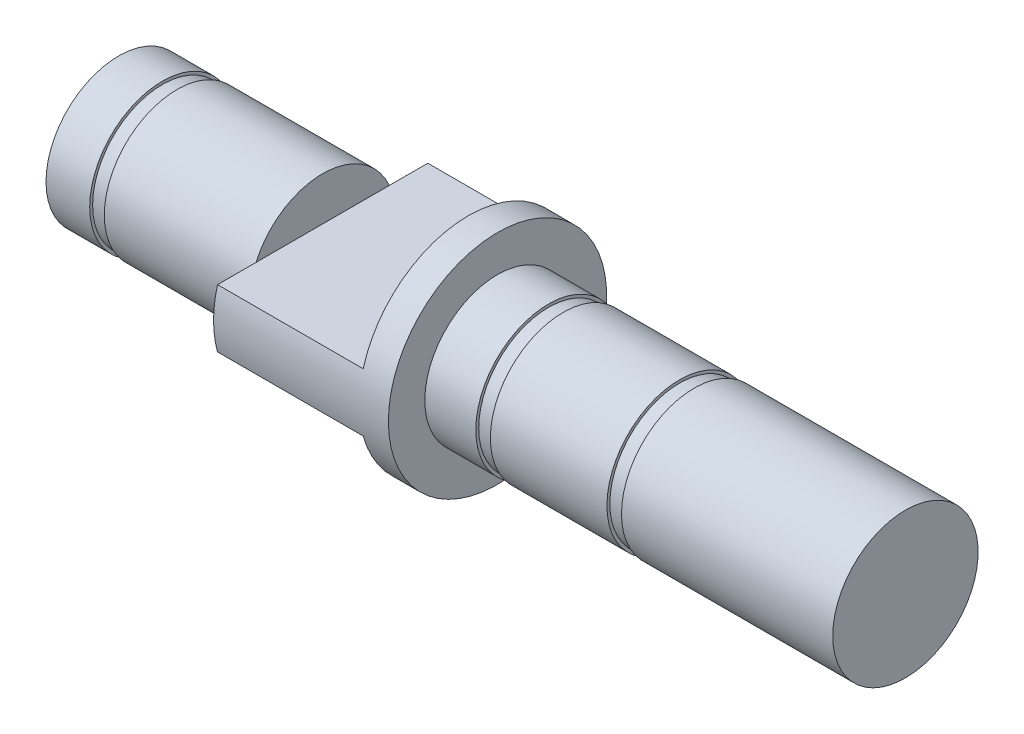
ISO-10303-21;
HEADER;
FILE_DESCRIPTION(('STEP AP214'),'2;1');
FILE_NAME('part.step','',(''),(''),'','','');
FILE_SCHEMA(('AUTOMOTIVE_DESIGN { 1 0 10303 214 1 1 1 1 }'));
ENDSEC;
DATA;
#1=APPLICATION_CONTEXT('core data for automotive mechanical design processes');
#2=APPLICATION_PROTOCOL_DEFINITION('international standard','automotive_design',2000,#1);
#3=PRODUCT_CONTEXT('',#1,'mechanical');
#4=PRODUCT('Part','Part','',(#3));
#5=PRODUCT_RELATED_PRODUCT_CATEGORY('part','',(#4));
#6=PRODUCT_DEFINITION_FORMATION('','',#4);
#7=PRODUCT_DEFINITION_CONTEXT('part definition',#1,'design');
#8=PRODUCT_DEFINITION('design','',#6,#7);
#9=PRODUCT_DEFINITION_SHAPE('','',#8);
#10=(LENGTH_UNIT() NAMED_UNIT(*) SI_UNIT(.MILLI.,.METRE.));
#11=(NAMED_UNIT(*) PLANE_ANGLE_UNIT() SI_UNIT($,.RADIAN.));
#12=(NAMED_UNIT(*) SI_UNIT($,.STERADIAN.) SOLID_ANGLE_UNIT());
#13=UNCERTAINTY_MEASURE_WITH_UNIT(LENGTH_MEASURE(1.E-05),#10,'distance_accuracy_value','');
#14=(GEOMETRIC_REPRESENTATION_CONTEXT(3) GLOBAL_UNCERTAINTY_ASSIGNED_CONTEXT((#13)) GLOBAL_UNIT_ASSIGNED_CONTEXT((#10,
#11,#12)) REPRESENTATION_CONTEXT('',''));
#15=CARTESIAN_POINT('',(0.,0.,0.));
#16=DIRECTION('',(0.,0.,1.));
#17=DIRECTION('',(1.,0.,0.));
#18=AXIS2_PLACEMENT_3D('',#15,#16,#17);
#19=CARTESIAN_POINT('',(14.,0.,-7.49));
#20=DIRECTION('',(1.,0.,0.));
#21=DIRECTION('',(0.,0.,-1.));
#22=AXIS2_PLACEMENT_3D('',#19,#20,#21);
#23=PLANE('',#22);
#24=CARTESIAN_POINT('',(14.,0.,0.));
#25=DIRECTION('',(-1.,0.,0.));
#26=DIRECTION('',(0.,0.,1.));
#27=AXIS2_PLACEMENT_3D('',#24,#25,#26);
#28=CIRCLE('',#27,7.49);
#29=CARTESIAN_POINT('',(14.,-2.,7.2180399001391));
#30=VERTEX_POINT('',#29);
#31=CARTESIAN_POINT('',(14.,2.,7.2180399001391));
#32=VERTEX_POINT('',#31);
#33=EDGE_CURVE('E111',#30,#32,#28,.T.);
#34=ORIENTED_EDGE('',*,*,#33,.T.);
#35=DIRECTION('',(0.,0.,1.));
#36=VECTOR('',#35,1.);
#37=CARTESIAN_POINT('',(14.,2.,7.22841614740048));
#38=LINE('',#37,#36);
#39=CARTESIAN_POINT('',(14.,2.,4.57166271721788));
#40=VERTEX_POINT('',#39);
#41=EDGE_CURVE('E115',#40,#32,#38,.T.);
#42=ORIENTED_EDGE('',*,*,#41,.F.);
#43=CARTESIAN_POINT('',(14.,0.,0.));
#44=DIRECTION('',(-1.,0.,0.));
#45=DIRECTION('',(0.,0.,1.));
#46=AXIS2_PLACEMENT_3D('',#43,#44,#45);
#47=CIRCLE('',#46,4.99);
#48=CARTESIAN_POINT('',(14.,-2.,4.57166271721789));
#49=VERTEX_POINT('',#48);
#50=EDGE_CURVE('E113',#49,#40,#47,.T.);
#51=ORIENTED_EDGE('',*,*,#50,.F.);
#52=DIRECTION('',(0.,0.,-1.));
#53=VECTOR('',#52,1.);
#54=CARTESIAN_POINT('',(14.,-2.,7.22841614740048));
#55=LINE('',#54,#53);
#56=EDGE_CURVE('E58',#30,#49,#55,.T.);
#57=ORIENTED_EDGE('',*,*,#56,.F.);
#58=EDGE_LOOP('',(#34,#42,#51,#57));
#59=FACE_BOUND('',#58,.T.);
#60=ADVANCED_FACE('F43',(#59),#23,.F.);
#61=CARTESIAN_POINT('',(0.,0.,-4.99));
#62=DIRECTION('',(1.,0.,0.));
#63=DIRECTION('',(0.,0.,-1.));
#64=AXIS2_PLACEMENT_3D('',#61,#62,#63);
#65=PLANE('',#64);
#66=CARTESIAN_POINT('',(0.,0.,0.));
#67=DIRECTION('',(-1.,0.,0.));
#68=DIRECTION('',(0.,0.,1.));
#69=AXIS2_PLACEMENT_3D('',#66,#67,#68);
#70=CIRCLE('',#69,4.99);
#71=CARTESIAN_POINT('',(0.,0.,4.99));
#72=VERTEX_POINT('',#71);
#73=EDGE_CURVE('E199',#72,#72,#70,.T.);
#74=ORIENTED_EDGE('',*,*,#73,.T.);
#75=EDGE_LOOP('',(#74));
#76=FACE_BOUND('',#75,.T.);
#77=ADVANCED_FACE('F45',(#76),#65,.F.);
#78=CARTESIAN_POINT('',(54.,0.,0.));
#79=DIRECTION('',(-1.,0.,0.));
#80=DIRECTION('',(0.,0.,1.));
#81=AXIS2_PLACEMENT_3D('',#78,#79,#80);
#82=PLANE('',#81);
#83=CARTESIAN_POINT('',(54.,0.,0.));
#84=DIRECTION('',(-1.,0.,0.));
#85=DIRECTION('',(0.,0.,1.));
#86=AXIS2_PLACEMENT_3D('',#83,#84,#85);
#87=CIRCLE('',#86,4.99000000000001);
#88=CARTESIAN_POINT('',(54.,0.,4.99000000000001));
#89=VERTEX_POINT('',#88);
#90=EDGE_CURVE('E162',#89,#89,#87,.T.);
#91=ORIENTED_EDGE('',*,*,#90,.F.);
#92=EDGE_LOOP('',(#91));
#93=FACE_BOUND('',#92,.T.);
#94=ADVANCED_FACE('F224',(#93),#82,.F.);
#95=CARTESIAN_POINT('',(0.,0.,0.));
#96=DIRECTION('',(-1.,0.,0.));
#97=DIRECTION('',(0.,0.,1.));
#98=AXIS2_PLACEMENT_3D('',#95,#96,#97);
#99=CYLINDRICAL_SURFACE('',#98,4.99000000000001);
#100=CARTESIAN_POINT('',(39.5,0.,0.));
#101=DIRECTION('',(-1.,0.,0.));
#102=DIRECTION('',(0.,0.,1.));
#103=AXIS2_PLACEMENT_3D('',#100,#101,#102);
#104=CIRCLE('',#103,4.99);
#105=CARTESIAN_POINT('',(39.5,0.,4.99));
#106=VERTEX_POINT('',#105);
#107=EDGE_CURVE('E159',#106,#106,#104,.T.);
#108=ORIENTED_EDGE('',*,*,#107,.F.);
#109=EDGE_LOOP('',(#108));
#110=FACE_BOUND('',#109,.T.);
#111=ORIENTED_EDGE('',*,*,#90,.T.);
#112=EDGE_LOOP('',(#111));
#113=FACE_BOUND('',#112,.T.);
#114=ADVANCED_FACE('F272',(#110,#113),#99,.T.);
#115=CARTESIAN_POINT('',(39.5,0.,-4.99));
#116=DIRECTION('',(1.,0.,0.));
#117=DIRECTION('',(0.,0.,-1.));
#118=AXIS2_PLACEMENT_3D('',#115,#116,#117);
#119=PLANE('',#118);
#120=CARTESIAN_POINT('',(39.5,0.,0.));
#121=DIRECTION('',(-1.,0.,0.));
#122=DIRECTION('',(0.,0.,1.));
#123=AXIS2_PLACEMENT_3D('',#120,#121,#122);
#124=CIRCLE('',#123,4.79000000000001);
#125=CARTESIAN_POINT('',(39.5,0.,4.79000000000001));
#126=VERTEX_POINT('',#125);
#127=EDGE_CURVE('E156',#126,#126,#124,.T.);
#128=ORIENTED_EDGE('',*,*,#127,.F.);
#129=EDGE_LOOP('',(#128));
#130=FACE_BOUND('',#129,.T.);
#131=ORIENTED_EDGE('',*,*,#107,.T.);
#132=EDGE_LOOP('',(#131));
#133=FACE_BOUND('',#132,.T.);
#134=ADVANCED_FACE('F268',(#130,#133),#119,.F.);
#135=CARTESIAN_POINT('',(0.,0.,0.));
#136=DIRECTION('',(-1.,0.,0.));
#137=DIRECTION('',(0.,0.,1.));
#138=AXIS2_PLACEMENT_3D('',#135,#136,#137);
#139=CYLINDRICAL_SURFACE('',#138,4.79000000000001);
#140=CARTESIAN_POINT('',(38.5,0.,0.));
#141=DIRECTION('',(-1.,0.,0.));
#142=DIRECTION('',(0.,0.,1.));
#143=AXIS2_PLACEMENT_3D('',#140,#141,#142);
#144=CIRCLE('',#143,4.79000000000001);
#145=CARTESIAN_POINT('',(38.5,0.,4.79000000000001));
#146=VERTEX_POINT('',#145);
#147=EDGE_CURVE('E153',#146,#146,#144,.T.);
#148=ORIENTED_EDGE('',*,*,#147,.F.);
#149=EDGE_LOOP('',(#148));
#150=FACE_BOUND('',#149,.T.);
#151=ORIENTED_EDGE('',*,*,#127,.T.);
#152=EDGE_LOOP('',(#151));
#153=FACE_BOUND('',#152,.T.);
#154=ADVANCED_FACE('F264',(#150,#153),#139,.T.);
#155=CARTESIAN_POINT('',(38.5,0.,-4.79000000000001));
#156=DIRECTION('',(-1.,0.,0.));
#157=DIRECTION('',(0.,0.,1.));
#158=AXIS2_PLACEMENT_3D('',#155,#156,#157);
#159=PLANE('',#158);
#160=CARTESIAN_POINT('',(38.5,0.,0.));
#161=DIRECTION('',(-1.,0.,0.));
#162=DIRECTION('',(0.,0.,1.));
#163=AXIS2_PLACEMENT_3D('',#160,#161,#162);
#164=CIRCLE('',#163,4.99);
#165=CARTESIAN_POINT('',(38.5,0.,4.99));
#166=VERTEX_POINT('',#165);
#167=EDGE_CURVE('E150',#166,#166,#164,.T.);
#168=ORIENTED_EDGE('',*,*,#167,.F.);
#169=EDGE_LOOP('',(#168));
#170=FACE_BOUND('',#169,.T.);
#171=ORIENTED_EDGE('',*,*,#147,.T.);
#172=EDGE_LOOP('',(#171));
#173=FACE_BOUND('',#172,.T.);
#174=ADVANCED_FACE('F260',(#170,#173),#159,.F.);
#175=CARTESIAN_POINT('',(0.,0.,0.));
#176=DIRECTION('',(-1.,0.,0.));
#177=DIRECTION('',(0.,0.,1.));
#178=AXIS2_PLACEMENT_3D('',#175,#176,#177);
#179=CYLINDRICAL_SURFACE('',#178,4.99);
#180=CARTESIAN_POINT('',(30.5,0.,0.));
#181=DIRECTION('',(-1.,0.,0.));
#182=DIRECTION('',(0.,0.,1.));
#183=AXIS2_PLACEMENT_3D('',#180,#181,#182);
#184=CIRCLE('',#183,4.99);
#185=CARTESIAN_POINT('',(30.5,0.,4.99));
#186=VERTEX_POINT('',#185);
#187=EDGE_CURVE('E147',#186,#186,#184,.T.);
#188=ORIENTED_EDGE('',*,*,#187,.F.);
#189=EDGE_LOOP('',(#188));
#190=FACE_BOUND('',#189,.T.);
#191=ORIENTED_EDGE('',*,*,#167,.T.);
#192=EDGE_LOOP('',(#191));
#193=FACE_BOUND('',#192,.T.);
#194=ADVANCED_FACE('F256',(#190,#193),#179,.T.);
#195=CARTESIAN_POINT('',(30.5,0.,-4.99));
#196=DIRECTION('',(1.,0.,0.));
#197=DIRECTION('',(0.,0.,-1.));
#198=AXIS2_PLACEMENT_3D('',#195,#196,#197);
#199=PLANE('',#198);
#200=CARTESIAN_POINT('',(30.5,0.,0.));
#201=DIRECTION('',(-1.,0.,0.));
#202=DIRECTION('',(0.,0.,1.));
#203=AXIS2_PLACEMENT_3D('',#200,#201,#202);
#204=CIRCLE('',#203,4.79000000000001);
#205=CARTESIAN_POINT('',(30.5,0.,4.79000000000001));
#206=VERTEX_POINT('',#205);
#207=EDGE_CURVE('E144',#206,#206,#204,.T.);
#208=ORIENTED_EDGE('',*,*,#207,.F.);
#209=EDGE_LOOP('',(#208));
#210=FACE_BOUND('',#209,.T.);
#211=ORIENTED_EDGE('',*,*,#187,.T.);
#212=EDGE_LOOP('',(#211));
#213=FACE_BOUND('',#212,.T.);
#214=ADVANCED_FACE('F252',(#210,#213),#199,.F.);
#215=CARTESIAN_POINT('',(0.,0.,0.));
#216=DIRECTION('',(-1.,0.,0.));
#217=DIRECTION('',(0.,0.,1.));
#218=AXIS2_PLACEMENT_3D('',#215,#216,#217);
#219=CYLINDRICAL_SURFACE('',#218,4.79000000000001);
#220=CARTESIAN_POINT('',(29.5,0.,0.));
#221=DIRECTION('',(-1.,0.,0.));
#222=DIRECTION('',(0.,0.,1.));
#223=AXIS2_PLACEMENT_3D('',#220,#221,#222);
#224=CIRCLE('',#223,4.79000000000001);
#225=CARTESIAN_POINT('',(29.5,0.,4.79000000000001));
#226=VERTEX_POINT('',#225);
#227=EDGE_CURVE('E141',#226,#226,#224,.T.);
#228=ORIENTED_EDGE('',*,*,#227,.F.);
#229=EDGE_LOOP('',(#228));
#230=FACE_BOUND('',#229,.T.);
#231=ORIENTED_EDGE('',*,*,#207,.T.);
#232=EDGE_LOOP('',(#231));
#233=FACE_BOUND('',#232,.T.);
#234=ADVANCED_FACE('F248',(#230,#233),#219,.T.);
#235=CARTESIAN_POINT('',(29.5,0.,-4.79000000000001));
#236=DIRECTION('',(-1.,0.,0.));
#237=DIRECTION('',(0.,0.,1.));
#238=AXIS2_PLACEMENT_3D('',#235,#236,#237);
#239=PLANE('',#238);
#240=CARTESIAN_POINT('',(29.5,0.,0.));
#241=DIRECTION('',(-1.,0.,0.));
#242=DIRECTION('',(0.,0.,1.));
#243=AXIS2_PLACEMENT_3D('',#240,#241,#242);
#244=CIRCLE('',#243,4.99);
#245=CARTESIAN_POINT('',(29.5,0.,4.99));
#246=VERTEX_POINT('',#245);
#247=EDGE_CURVE('E138',#246,#246,#244,.T.);
#248=ORIENTED_EDGE('',*,*,#247,.F.);
#249=EDGE_LOOP('',(#248));
#250=FACE_BOUND('',#249,.T.);
#251=ORIENTED_EDGE('',*,*,#227,.T.);
#252=EDGE_LOOP('',(#251));
#253=FACE_BOUND('',#252,.T.);
#254=ADVANCED_FACE('F244',(#250,#253),#239,.F.);
#255=CARTESIAN_POINT('',(0.,0.,0.));
#256=DIRECTION('',(-1.,0.,0.));
#257=DIRECTION('',(0.,0.,1.));
#258=AXIS2_PLACEMENT_3D('',#255,#256,#257);
#259=CYLINDRICAL_SURFACE('',#258,4.99);
#260=CARTESIAN_POINT('',(26.,0.,0.));
#261=DIRECTION('',(-1.,0.,0.));
#262=DIRECTION('',(0.,0.,1.));
#263=AXIS2_PLACEMENT_3D('',#260,#261,#262);
#264=CIRCLE('',#263,4.99);
#265=CARTESIAN_POINT('',(26.,0.,4.99));
#266=VERTEX_POINT('',#265);
#267=EDGE_CURVE('E135',#266,#266,#264,.T.);
#268=ORIENTED_EDGE('',*,*,#267,.F.);
#269=EDGE_LOOP('',(#268));
#270=FACE_BOUND('',#269,.T.);
#271=ORIENTED_EDGE('',*,*,#247,.T.);
#272=EDGE_LOOP('',(#271));
#273=FACE_BOUND('',#272,.T.);
#274=ADVANCED_FACE('F238',(#270,#273),#259,.T.);
#275=CARTESIAN_POINT('',(26.,0.,-4.99));
#276=DIRECTION('',(-1.,0.,0.));
#277=DIRECTION('',(0.,0.,1.));
#278=AXIS2_PLACEMENT_3D('',#275,#276,#277);
#279=PLANE('',#278);
#280=CARTESIAN_POINT('',(26.,0.,0.));
#281=DIRECTION('',(-1.,0.,0.));
#282=DIRECTION('',(0.,0.,1.));
#283=AXIS2_PLACEMENT_3D('',#280,#281,#282);
#284=CIRCLE('',#283,7.49);
#285=CARTESIAN_POINT('',(26.,0.,7.49));
#286=VERTEX_POINT('',#285);
#287=EDGE_CURVE('E127',#286,#286,#284,.T.);
#288=ORIENTED_EDGE('',*,*,#287,.F.);
#289=EDGE_LOOP('',(#288));
#290=FACE_BOUND('',#289,.T.);
#291=ORIENTED_EDGE('',*,*,#267,.T.);
#292=EDGE_LOOP('',(#291));
#293=FACE_BOUND('',#292,.T.);
#294=ADVANCED_FACE('F234',(#290,#293),#279,.F.);
#295=CARTESIAN_POINT('',(0.,0.,0.));
#296=DIRECTION('',(-1.,0.,0.));
#297=DIRECTION('',(0.,0.,1.));
#298=AXIS2_PLACEMENT_3D('',#295,#296,#297);
#299=CYLINDRICAL_SURFACE('',#298,7.49);
#300=CARTESIAN_POINT('',(24.,0.,0.));
#301=DIRECTION('',(1.,0.,0.));
#302=DIRECTION('',(0.,0.,-1.));
#303=AXIS2_PLACEMENT_3D('',#300,#301,#302);
#304=CIRCLE('',#303,7.49);
#305=CARTESIAN_POINT('',(24.,2.,-7.2180399001391));
#306=VERTEX_POINT('',#305);
#307=CARTESIAN_POINT('',(24.,2.,7.2180399001391));
#308=VERTEX_POINT('',#307);
#309=EDGE_CURVE('E11',#306,#308,#304,.T.);
#310=ORIENTED_EDGE('',*,*,#309,.T.);
#311=DIRECTION('',(-1.,0.,0.));
#312=VECTOR('',#311,1.);
#313=CARTESIAN_POINT('',(0.,2.,7.2180399001391));
#314=LINE('',#313,#312);
#315=EDGE_CURVE('E122',#308,#32,#314,.T.);
#316=ORIENTED_EDGE('',*,*,#315,.T.);
#317=ORIENTED_EDGE('',*,*,#33,.F.);
#318=DIRECTION('',(-1.,0.,0.));
#319=VECTOR('',#318,1.);
#320=CARTESIAN_POINT('',(0.,-2.,7.2180399001391));
#321=LINE('',#320,#319);
#322=CARTESIAN_POINT('',(24.,-2.,7.2180399001391));
#323=VERTEX_POINT('',#322);
#324=EDGE_CURVE('E97',#30,#323,#321,.F.);
#325=ORIENTED_EDGE('',*,*,#324,.T.);
#326=CARTESIAN_POINT('',(24.,0.,0.));
#327=DIRECTION('',(-1.,0.,0.));
#328=DIRECTION('',(0.,0.,1.));
#329=AXIS2_PLACEMENT_3D('',#326,#327,#328);
#330=CIRCLE('',#329,7.49);
#331=CARTESIAN_POINT('',(24.,-2.,-7.2180399001391));
#332=VERTEX_POINT('',#331);
#333=EDGE_CURVE('E51',#332,#323,#330,.T.);
#334=ORIENTED_EDGE('',*,*,#333,.F.);
#335=DIRECTION('',(-1.,0.,0.));
#336=VECTOR('',#335,1.);
#337=CARTESIAN_POINT('',(0.,-2.,-7.2180399001391));
#338=LINE('',#337,#336);
#339=CARTESIAN_POINT('',(14.,-2.,-7.2180399001391));
#340=VERTEX_POINT('',#339);
#341=EDGE_CURVE('E104',#332,#340,#338,.T.);
#342=ORIENTED_EDGE('',*,*,#341,.T.);
#343=CARTESIAN_POINT('',(14.,2.,-7.2180399001391));
#344=VERTEX_POINT('',#343);
#345=EDGE_CURVE('E123',#344,#340,#28,.T.);
#346=ORIENTED_EDGE('',*,*,#345,.F.);
#347=DIRECTION('',(-1.,0.,0.));
#348=VECTOR('',#347,1.);
#349=CARTESIAN_POINT('',(0.,2.,-7.2180399001391));
#350=LINE('',#349,#348);
#351=EDGE_CURVE('E169',#344,#306,#350,.F.);
#352=ORIENTED_EDGE('',*,*,#351,.T.);
#353=EDGE_LOOP('',(#310,#316,#317,#325,#334,#342,#346,#352));
#354=FACE_BOUND('',#353,.T.);
#355=ORIENTED_EDGE('',*,*,#287,.T.);
#356=EDGE_LOOP('',(#355));
#357=FACE_BOUND('',#356,.T.);
#358=ADVANCED_FACE('F120',(#354,#357),#299,.T.);
#359=CARTESIAN_POINT('',(14.,2.,-4.57166271721788));
#360=VERTEX_POINT('',#359);
#361=CARTESIAN_POINT('',(14.,-2.,-4.57166271721789));
#362=VERTEX_POINT('',#361);
#363=EDGE_CURVE('E129',#360,#362,#47,.T.);
#364=ORIENTED_EDGE('',*,*,#363,.F.);
#365=EDGE_CURVE('E66',#344,#360,#38,.T.);
#366=ORIENTED_EDGE('',*,*,#365,.F.);
#367=ORIENTED_EDGE('',*,*,#345,.T.);
#368=EDGE_CURVE('E118',#362,#340,#55,.T.);
#369=ORIENTED_EDGE('',*,*,#368,.F.);
#370=EDGE_LOOP('',(#364,#366,#367,#369));
#371=FACE_BOUND('',#370,.T.);
#372=ADVANCED_FACE('F174',(#371),#23,.F.);
#373=CARTESIAN_POINT('',(0.,0.,0.));
#374=DIRECTION('',(-1.,0.,0.));
#375=DIRECTION('',(0.,0.,1.));
#376=AXIS2_PLACEMENT_3D('',#373,#374,#375);
#377=CYLINDRICAL_SURFACE('',#376,4.99);
#378=CARTESIAN_POINT('',(4.,0.,0.));
#379=DIRECTION('',(-1.,0.,0.));
#380=DIRECTION('',(0.,0.,1.));
#381=AXIS2_PLACEMENT_3D('',#378,#379,#380);
#382=CIRCLE('',#381,4.99);
#383=CARTESIAN_POINT('',(4.,0.,4.99));
#384=VERTEX_POINT('',#383);
#385=EDGE_CURVE('E185',#384,#384,#382,.T.);
#386=ORIENTED_EDGE('',*,*,#385,.F.);
#387=EDGE_LOOP('',(#386));
#388=FACE_BOUND('',#387,.T.);
#389=EDGE_CURVE('E124',#40,#360,#47,.T.);
#390=ORIENTED_EDGE('',*,*,#389,.T.);
#391=ORIENTED_EDGE('',*,*,#363,.T.);
#392=EDGE_CURVE('E184',#362,#49,#47,.T.);
#393=ORIENTED_EDGE('',*,*,#392,.T.);
#394=ORIENTED_EDGE('',*,*,#50,.T.);
#395=EDGE_LOOP('',(#390,#391,#393,#394));
#396=FACE_BOUND('',#395,.T.);
#397=ADVANCED_FACE('F183',(#388,#396),#377,.T.);
#398=CARTESIAN_POINT('',(4.,0.,-4.99));
#399=DIRECTION('',(1.,0.,0.));
#400=DIRECTION('',(0.,0.,-1.));
#401=AXIS2_PLACEMENT_3D('',#398,#399,#400);
#402=PLANE('',#401);
#403=CARTESIAN_POINT('',(4.,0.,0.));
#404=DIRECTION('',(-1.,0.,0.));
#405=DIRECTION('',(0.,0.,1.));
#406=AXIS2_PLACEMENT_3D('',#403,#404,#405);
#407=CIRCLE('',#406,4.79);
#408=CARTESIAN_POINT('',(4.,0.,4.79));
#409=VERTEX_POINT('',#408);
#410=EDGE_CURVE('E187',#409,#409,#407,.T.);
#411=ORIENTED_EDGE('',*,*,#410,.F.);
#412=EDGE_LOOP('',(#411));
#413=FACE_BOUND('',#412,.T.);
#414=ORIENTED_EDGE('',*,*,#385,.T.);
#415=EDGE_LOOP('',(#414));
#416=FACE_BOUND('',#415,.T.);
#417=ADVANCED_FACE('F232',(#413,#416),#402,.F.);
#418=CARTESIAN_POINT('',(0.,0.,0.));
#419=DIRECTION('',(-1.,0.,0.));
#420=DIRECTION('',(0.,0.,1.));
#421=AXIS2_PLACEMENT_3D('',#418,#419,#420);
#422=CYLINDRICAL_SURFACE('',#421,4.79);
#423=CARTESIAN_POINT('',(3.,0.,0.));
#424=DIRECTION('',(-1.,0.,0.));
#425=DIRECTION('',(0.,0.,1.));
#426=AXIS2_PLACEMENT_3D('',#423,#424,#425);
#427=CIRCLE('',#426,4.79);
#428=CARTESIAN_POINT('',(3.,0.,4.79));
#429=VERTEX_POINT('',#428);
#430=EDGE_CURVE('E191',#429,#429,#427,.T.);
#431=ORIENTED_EDGE('',*,*,#430,.F.);
#432=EDGE_LOOP('',(#431));
#433=FACE_BOUND('',#432,.T.);
#434=ORIENTED_EDGE('',*,*,#410,.T.);
#435=EDGE_LOOP('',(#434));
#436=FACE_BOUND('',#435,.T.);
#437=ADVANCED_FACE('F341',(#433,#436),#422,.T.);
#438=CARTESIAN_POINT('',(3.,0.,-4.79));
#439=DIRECTION('',(-1.,0.,0.));
#440=DIRECTION('',(0.,0.,1.));
#441=AXIS2_PLACEMENT_3D('',#438,#439,#440);
#442=PLANE('',#441);
#443=CARTESIAN_POINT('',(3.,0.,0.));
#444=DIRECTION('',(-1.,0.,0.));
#445=DIRECTION('',(0.,0.,1.));
#446=AXIS2_PLACEMENT_3D('',#443,#444,#445);
#447=CIRCLE('',#446,4.99);
#448=CARTESIAN_POINT('',(3.,0.,4.99));
#449=VERTEX_POINT('',#448);
#450=EDGE_CURVE('E196',#449,#449,#447,.T.);
#451=ORIENTED_EDGE('',*,*,#450,.F.);
#452=EDGE_LOOP('',(#451));
#453=FACE_BOUND('',#452,.T.);
#454=ORIENTED_EDGE('',*,*,#430,.T.);
#455=EDGE_LOOP('',(#454));
#456=FACE_BOUND('',#455,.T.);
#457=ADVANCED_FACE('F351',(#453,#456),#442,.F.);
#458=CARTESIAN_POINT('',(0.,0.,0.));
#459=DIRECTION('',(-1.,0.,0.));
#460=DIRECTION('',(0.,0.,1.));
#461=AXIS2_PLACEMENT_3D('',#458,#459,#460);
#462=CYLINDRICAL_SURFACE('',#461,4.99);
#463=ORIENTED_EDGE('',*,*,#73,.F.);
#464=EDGE_LOOP('',(#463));
#465=FACE_BOUND('',#464,.T.);
#466=ORIENTED_EDGE('',*,*,#450,.T.);
#467=EDGE_LOOP('',(#466));
#468=FACE_BOUND('',#467,.T.);
#469=ADVANCED_FACE('F359',(#465,#468),#462,.T.);
#470=CARTESIAN_POINT('',(24.,0.,0.));
#471=DIRECTION('',(-1.,0.,0.));
#472=DIRECTION('',(0.,0.,1.));
#473=AXIS2_PLACEMENT_3D('',#470,#471,#472);
#474=PLANE('',#473);
#475=ORIENTED_EDGE('',*,*,#333,.T.);
#476=DIRECTION('',(0.,0.,-1.));
#477=VECTOR('',#476,1.);
#478=CARTESIAN_POINT('',(24.,-2.,7.22841614740048));
#479=LINE('',#478,#477);
#480=EDGE_CURVE('E100',#323,#332,#479,.T.);
#481=ORIENTED_EDGE('',*,*,#480,.T.);
#482=EDGE_LOOP('',(#475,#481));
#483=FACE_BOUND('',#482,.T.);
#484=ADVANCED_FACE('F165',(#483),#474,.T.);
#485=CARTESIAN_POINT('',(24.,-2.,7.22841614740048));
#486=DIRECTION('',(0.,1.,0.));
#487=DIRECTION('',(0.,0.,1.));
#488=AXIS2_PLACEMENT_3D('',#485,#486,#487);
#489=PLANE('',#488);
#490=ORIENTED_EDGE('',*,*,#480,.F.);
#491=ORIENTED_EDGE('',*,*,#324,.F.);
#492=ORIENTED_EDGE('',*,*,#56,.T.);
#493=EDGE_CURVE('E116',#49,#362,#55,.T.);
#494=ORIENTED_EDGE('',*,*,#493,.T.);
#495=ORIENTED_EDGE('',*,*,#368,.T.);
#496=ORIENTED_EDGE('',*,*,#341,.F.);
#497=EDGE_LOOP('',(#490,#491,#492,#494,#495,#496));
#498=FACE_BOUND('',#497,.T.);
#499=ADVANCED_FACE('F98',(#498),#489,.F.);
#500=CARTESIAN_POINT('',(14.,0.,0.));
#501=DIRECTION('',(-1.,0.,0.));
#502=DIRECTION('',(0.,0.,1.));
#503=AXIS2_PLACEMENT_3D('',#500,#501,#502);
#504=PLANE('',#503);
#505=ORIENTED_EDGE('',*,*,#493,.F.);
#506=ORIENTED_EDGE('',*,*,#392,.F.);
#507=EDGE_LOOP('',(#505,#506));
#508=FACE_BOUND('',#507,.T.);
#509=ADVANCED_FACE('F205',(#508),#504,.F.);
#510=CARTESIAN_POINT('',(24.,0.,0.));
#511=DIRECTION('',(1.,0.,0.));
#512=DIRECTION('',(0.,0.,-1.));
#513=AXIS2_PLACEMENT_3D('',#510,#511,#512);
#514=PLANE('',#513);
#515=DIRECTION('',(0.,0.,1.));
#516=VECTOR('',#515,1.);
#517=CARTESIAN_POINT('',(24.,2.,7.22841614740048));
#518=LINE('',#517,#516);
#519=EDGE_CURVE('E105',#306,#308,#518,.T.);
#520=ORIENTED_EDGE('',*,*,#519,.T.);
#521=ORIENTED_EDGE('',*,*,#309,.F.);
#522=EDGE_LOOP('',(#520,#521));
#523=FACE_BOUND('',#522,.T.);
#524=ADVANCED_FACE('F207',(#523),#514,.F.);
#525=CARTESIAN_POINT('',(24.,2.,7.22841614740048));
#526=DIRECTION('',(0.,-1.,0.));
#527=DIRECTION('',(0.,0.,-1.));
#528=AXIS2_PLACEMENT_3D('',#525,#526,#527);
#529=PLANE('',#528);
#530=ORIENTED_EDGE('',*,*,#519,.F.);
#531=ORIENTED_EDGE('',*,*,#351,.F.);
#532=ORIENTED_EDGE('',*,*,#365,.T.);
#533=EDGE_CURVE('E176',#360,#40,#38,.T.);
#534=ORIENTED_EDGE('',*,*,#533,.T.);
#535=ORIENTED_EDGE('',*,*,#41,.T.);
#536=ORIENTED_EDGE('',*,*,#315,.F.);
#537=EDGE_LOOP('',(#530,#531,#532,#534,#535,#536));
#538=FACE_BOUND('',#537,.T.);
#539=ADVANCED_FACE('F181',(#538),#529,.F.);
#540=CARTESIAN_POINT('',(14.,0.,0.));
#541=DIRECTION('',(1.,0.,0.));
#542=DIRECTION('',(0.,0.,-1.));
#543=AXIS2_PLACEMENT_3D('',#540,#541,#542);
#544=PLANE('',#543);
#545=ORIENTED_EDGE('',*,*,#389,.F.);
#546=ORIENTED_EDGE('',*,*,#533,.F.);
#547=EDGE_LOOP('',(#545,#546));
#548=FACE_BOUND('',#547,.T.);
#549=ADVANCED_FACE('F406',(#548),#544,.T.);
#550=CLOSED_SHELL('',(#60,#77,#94,#114,#134,#154,#174,#194,#214,#234,#254,#274,#294,#358,#372,
#397,#417,#437,#457,#469,#484,#499,#509,#524,#539,#549));
#551=MANIFOLD_SOLID_BREP('B2',#550);
#552=ADVANCED_BREP_SHAPE_REPRESENTATION('',(#18,#551),#14);
#553=SHAPE_DEFINITION_REPRESENTATION(#9,#552);
ENDSEC;
END-ISO-10303-21;
